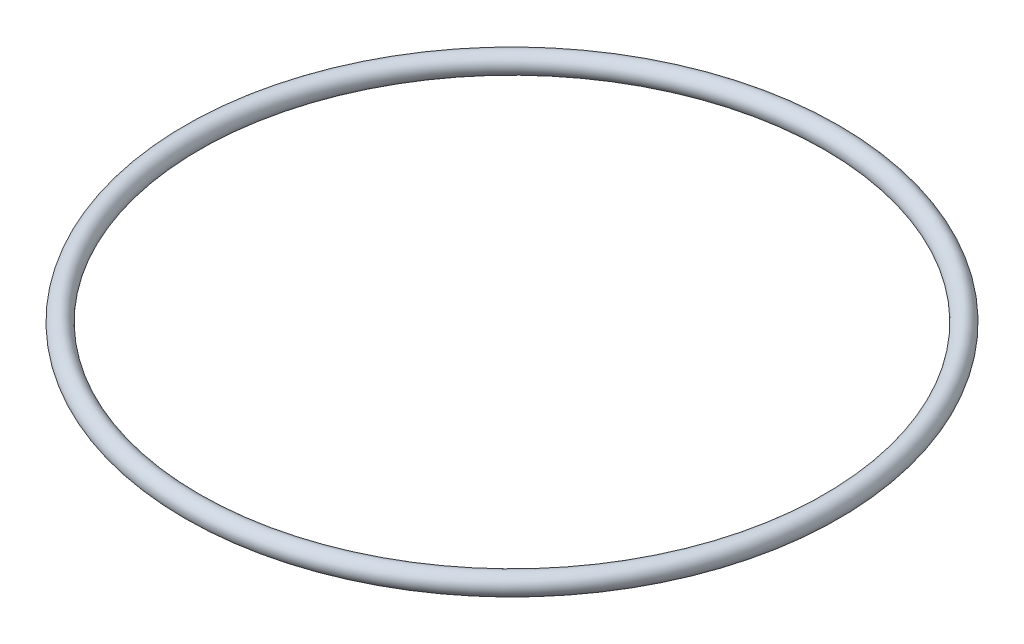
ISO-10303-21;
HEADER;
FILE_DESCRIPTION(('STEP AP214'),'2;1');
FILE_NAME('part.step','',(''),(''),'','','');
FILE_SCHEMA(('AUTOMOTIVE_DESIGN { 1 0 10303 214 1 1 1 1 }'));
ENDSEC;
DATA;
#1=APPLICATION_CONTEXT('core data for automotive mechanical design processes');
#2=APPLICATION_PROTOCOL_DEFINITION('international standard','automotive_design',2000,#1);
#3=PRODUCT_CONTEXT('',#1,'mechanical');
#4=PRODUCT('Part','Part','',(#3));
#5=PRODUCT_RELATED_PRODUCT_CATEGORY('part','',(#4));
#6=PRODUCT_DEFINITION_FORMATION('','',#4);
#7=PRODUCT_DEFINITION_CONTEXT('part definition',#1,'design');
#8=PRODUCT_DEFINITION('design','',#6,#7);
#9=PRODUCT_DEFINITION_SHAPE('','',#8);
#10=(LENGTH_UNIT() NAMED_UNIT(*) SI_UNIT(.MILLI.,.METRE.));
#11=(NAMED_UNIT(*) PLANE_ANGLE_UNIT() SI_UNIT($,.RADIAN.));
#12=(NAMED_UNIT(*) SI_UNIT($,.STERADIAN.) SOLID_ANGLE_UNIT());
#13=UNCERTAINTY_MEASURE_WITH_UNIT(LENGTH_MEASURE(1.E-05),#10,'distance_accuracy_value','');
#14=(GEOMETRIC_REPRESENTATION_CONTEXT(3) GLOBAL_UNCERTAINTY_ASSIGNED_CONTEXT((#13)) GLOBAL_UNIT_ASSIGNED_CONTEXT((#10,
#11,#12)) REPRESENTATION_CONTEXT('',''));
#15=CARTESIAN_POINT('',(0.,0.,0.));
#16=DIRECTION('',(0.,0.,1.));
#17=DIRECTION('',(1.,0.,0.));
#18=AXIS2_PLACEMENT_3D('',#15,#16,#17);
#19=CARTESIAN_POINT('',(0.,0.,0.));
#20=DIRECTION('',(0.,-1.,0.));
#21=DIRECTION('',(0.,0.,-1.));
#22=AXIS2_PLACEMENT_3D('',#19,#20,#21);
#23=TOROIDAL_SURFACE('',#22,400.,12.5);
#24=CARTESIAN_POINT('',(0.,0.,-412.5));
#25=VERTEX_POINT('',#24);
#26=VERTEX_LOOP('',#25);
#27=FACE_BOUND('',#26,.T.);
#28=ADVANCED_FACE('F35',(#27),#23,.T.);
#29=CLOSED_SHELL('',(#28));
#30=MANIFOLD_SOLID_BREP('B2',#29);
#31=ADVANCED_BREP_SHAPE_REPRESENTATION('',(#18,#30),#14);
#32=SHAPE_DEFINITION_REPRESENTATION(#9,#31);
ENDSEC;
END-ISO-10303-21;
